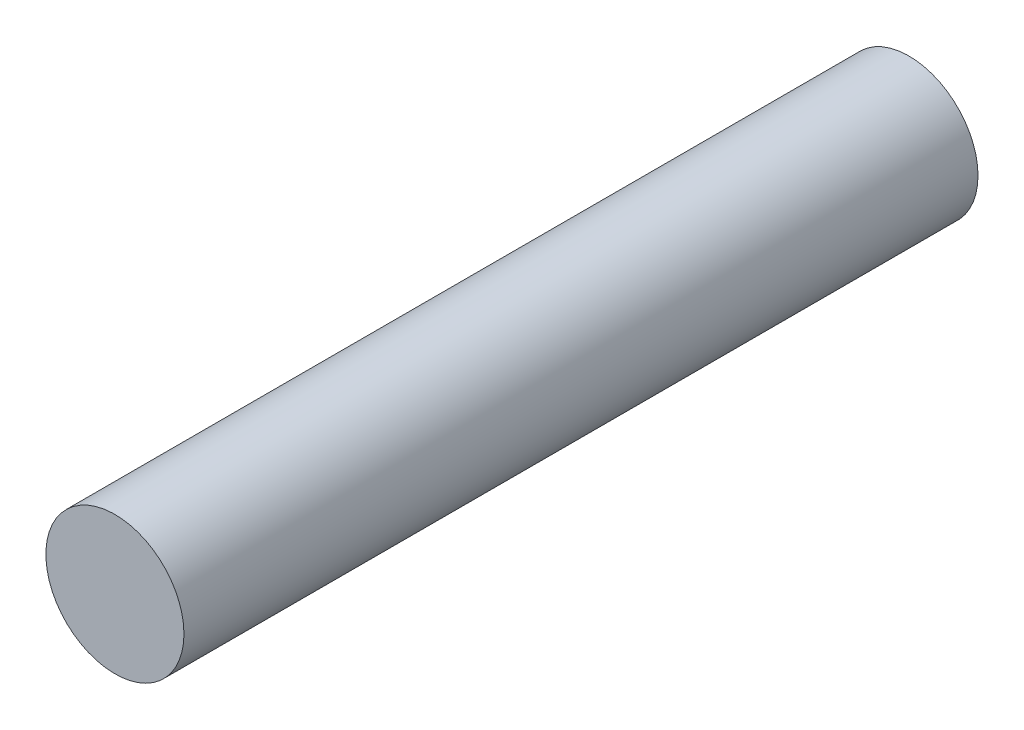
ISO-10303-21;
HEADER;
FILE_DESCRIPTION(('STEP AP214'),'2;1');
FILE_NAME('part.step','',(''),(''),'','','');
FILE_SCHEMA(('AUTOMOTIVE_DESIGN { 1 0 10303 214 1 1 1 1 }'));
ENDSEC;
DATA;
#1=APPLICATION_CONTEXT('core data for automotive mechanical design processes');
#2=APPLICATION_PROTOCOL_DEFINITION('international standard','automotive_design',2000,#1);
#3=PRODUCT_CONTEXT('',#1,'mechanical');
#4=PRODUCT('Part','Part','',(#3));
#5=PRODUCT_RELATED_PRODUCT_CATEGORY('part','',(#4));
#6=PRODUCT_DEFINITION_FORMATION('','',#4);
#7=PRODUCT_DEFINITION_CONTEXT('part definition',#1,'design');
#8=PRODUCT_DEFINITION('design','',#6,#7);
#9=PRODUCT_DEFINITION_SHAPE('','',#8);
#10=(LENGTH_UNIT() NAMED_UNIT(*) SI_UNIT(.MILLI.,.METRE.));
#11=(NAMED_UNIT(*) PLANE_ANGLE_UNIT() SI_UNIT($,.RADIAN.));
#12=(NAMED_UNIT(*) SI_UNIT($,.STERADIAN.) SOLID_ANGLE_UNIT());
#13=UNCERTAINTY_MEASURE_WITH_UNIT(LENGTH_MEASURE(1.E-05),#10,'distance_accuracy_value','');
#14=(GEOMETRIC_REPRESENTATION_CONTEXT(3) GLOBAL_UNCERTAINTY_ASSIGNED_CONTEXT((#13)) GLOBAL_UNIT_ASSIGNED_CONTEXT((#10,
#11,#12)) REPRESENTATION_CONTEXT('',''));
#15=CARTESIAN_POINT('',(0.,0.,0.));
#16=DIRECTION('',(0.,0.,1.));
#17=DIRECTION('',(1.,0.,0.));
#18=AXIS2_PLACEMENT_3D('',#15,#16,#17);
#19=CARTESIAN_POINT('',(0.,0.,115.));
#20=DIRECTION('',(0.,0.,-1.));
#21=DIRECTION('',(-1.,0.,0.));
#22=AXIS2_PLACEMENT_3D('',#19,#20,#21);
#23=CYLINDRICAL_SURFACE('',#22,10.);
#24=CARTESIAN_POINT('',(0.,0.,115.));
#25=DIRECTION('',(0.,0.,1.));
#26=DIRECTION('',(1.,0.,0.));
#27=AXIS2_PLACEMENT_3D('',#24,#25,#26);
#28=CIRCLE('',#27,10.);
#29=CARTESIAN_POINT('',(10.,0.,115.));
#30=VERTEX_POINT('',#29);
#31=EDGE_CURVE('E10',#30,#30,#28,.T.);
#32=ORIENTED_EDGE('',*,*,#31,.F.);
#33=EDGE_LOOP('',(#32));
#34=FACE_BOUND('',#33,.T.);
#35=CARTESIAN_POINT('',(0.,0.,0.));
#36=DIRECTION('',(0.,0.,1.));
#37=DIRECTION('',(1.,0.,0.));
#38=AXIS2_PLACEMENT_3D('',#35,#36,#37);
#39=CIRCLE('',#38,10.);
#40=CARTESIAN_POINT('',(10.,0.,0.));
#41=VERTEX_POINT('',#40);
#42=EDGE_CURVE('E34',#41,#41,#39,.T.);
#43=ORIENTED_EDGE('',*,*,#42,.T.);
#44=EDGE_LOOP('',(#43));
#45=FACE_BOUND('',#44,.T.);
#46=ADVANCED_FACE('F31',(#34,#45),#23,.T.);
#47=CARTESIAN_POINT('',(0.,0.,115.));
#48=DIRECTION('',(0.,0.,1.));
#49=DIRECTION('',(1.,0.,0.));
#50=AXIS2_PLACEMENT_3D('',#47,#48,#49);
#51=PLANE('',#50);
#52=ORIENTED_EDGE('',*,*,#31,.T.);
#53=EDGE_LOOP('',(#52));
#54=FACE_BOUND('',#53,.T.);
#55=ADVANCED_FACE('F46',(#54),#51,.T.);
#56=CARTESIAN_POINT('',(0.,0.,0.));
#57=DIRECTION('',(0.,0.,1.));
#58=DIRECTION('',(1.,0.,0.));
#59=AXIS2_PLACEMENT_3D('',#56,#57,#58);
#60=PLANE('',#59);
#61=ORIENTED_EDGE('',*,*,#42,.F.);
#62=EDGE_LOOP('',(#61));
#63=FACE_BOUND('',#62,.T.);
#64=ADVANCED_FACE('F44',(#63),#60,.F.);
#65=CLOSED_SHELL('',(#46,#55,#64));
#66=MANIFOLD_SOLID_BREP('B2',#65);
#67=ADVANCED_BREP_SHAPE_REPRESENTATION('',(#18,#66),#14);
#68=SHAPE_DEFINITION_REPRESENTATION(#9,#67);
ENDSEC;
END-ISO-10303-21;
